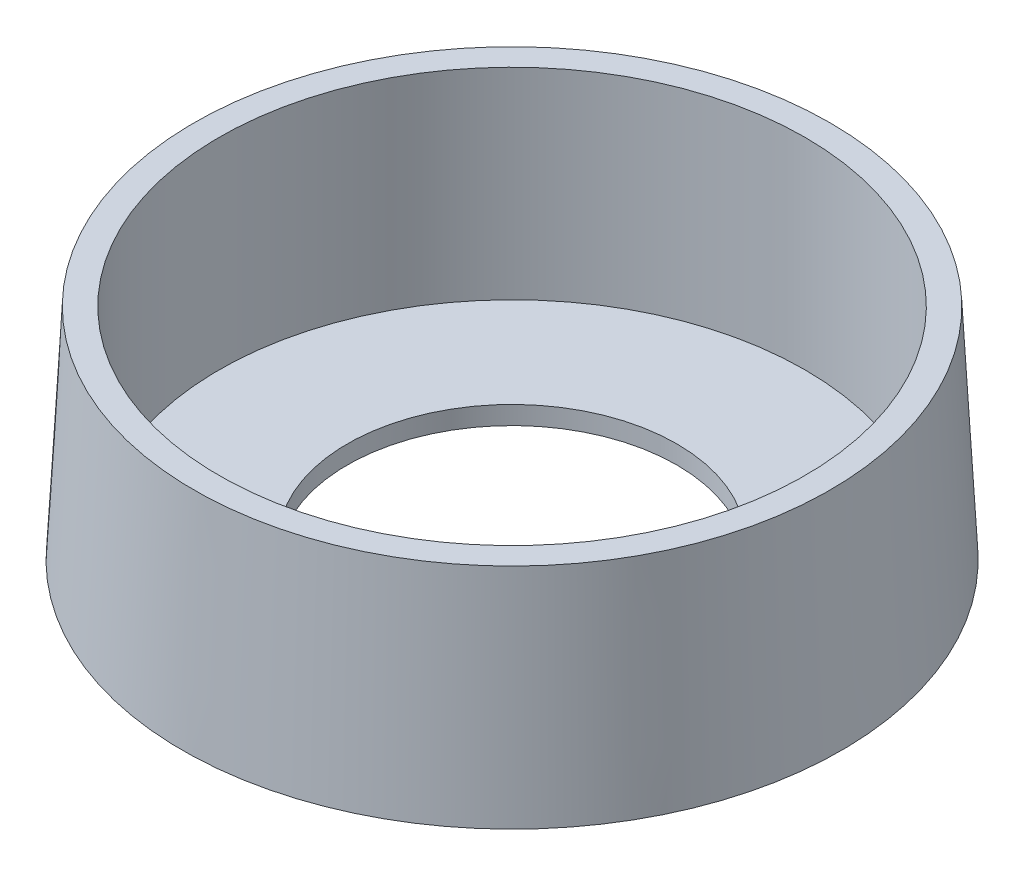
ISO-10303-21;
HEADER;
FILE_DESCRIPTION(('STEP AP214'),'2;1');
FILE_NAME('part.step','',(''),(''),'','','');
FILE_SCHEMA(('AUTOMOTIVE_DESIGN { 1 0 10303 214 1 1 1 1 }'));
ENDSEC;
DATA;
#1=APPLICATION_CONTEXT('core data for automotive mechanical design processes');
#2=APPLICATION_PROTOCOL_DEFINITION('international standard','automotive_design',2000,#1);
#3=PRODUCT_CONTEXT('',#1,'mechanical');
#4=PRODUCT('Part','Part','',(#3));
#5=PRODUCT_RELATED_PRODUCT_CATEGORY('part','',(#4));
#6=PRODUCT_DEFINITION_FORMATION('','',#4);
#7=PRODUCT_DEFINITION_CONTEXT('part definition',#1,'design');
#8=PRODUCT_DEFINITION('design','',#6,#7);
#9=PRODUCT_DEFINITION_SHAPE('','',#8);
#10=(LENGTH_UNIT() NAMED_UNIT(*) SI_UNIT(.MILLI.,.METRE.));
#11=(NAMED_UNIT(*) PLANE_ANGLE_UNIT() SI_UNIT($,.RADIAN.));
#12=(NAMED_UNIT(*) SI_UNIT($,.STERADIAN.) SOLID_ANGLE_UNIT());
#13=UNCERTAINTY_MEASURE_WITH_UNIT(LENGTH_MEASURE(1.E-05),#10,'distance_accuracy_value','');
#14=(GEOMETRIC_REPRESENTATION_CONTEXT(3) GLOBAL_UNCERTAINTY_ASSIGNED_CONTEXT((#13)) GLOBAL_UNIT_ASSIGNED_CONTEXT((#10,
#11,#12)) REPRESENTATION_CONTEXT('',''));
#15=CARTESIAN_POINT('',(0.,0.,0.));
#16=DIRECTION('',(0.,0.,1.));
#17=DIRECTION('',(1.,0.,0.));
#18=AXIS2_PLACEMENT_3D('',#15,#16,#17);
#19=CARTESIAN_POINT('',(0.,0.,0.));
#20=DIRECTION('',(0.,-1.,0.));
#21=DIRECTION('',(0.,0.,-1.));
#22=AXIS2_PLACEMENT_3D('',#19,#20,#21);
#23=CYLINDRICAL_SURFACE('',#22,4.5);
#24=CARTESIAN_POINT('',(0.,0.5,0.));
#25=DIRECTION('',(0.,-1.,0.));
#26=DIRECTION('',(0.,0.,-1.));
#27=AXIS2_PLACEMENT_3D('',#24,#25,#26);
#28=CIRCLE('',#27,4.5);
#29=CARTESIAN_POINT('',(0.,0.5,-4.5));
#30=VERTEX_POINT('',#29);
#31=EDGE_CURVE('E60',#30,#30,#28,.T.);
#32=ORIENTED_EDGE('',*,*,#31,.F.);
#33=EDGE_LOOP('',(#32));
#34=FACE_BOUND('',#33,.T.);
#35=CARTESIAN_POINT('',(0.,0.,0.));
#36=DIRECTION('',(0.,-1.,0.));
#37=DIRECTION('',(0.,0.,-1.));
#38=AXIS2_PLACEMENT_3D('',#35,#36,#37);
#39=CIRCLE('',#38,4.5);
#40=CARTESIAN_POINT('',(0.,0.,-4.5));
#41=VERTEX_POINT('',#40);
#42=EDGE_CURVE('E10',#41,#41,#39,.T.);
#43=ORIENTED_EDGE('',*,*,#42,.T.);
#44=EDGE_LOOP('',(#43));
#45=FACE_BOUND('',#44,.T.);
#46=ADVANCED_FACE('F40',(#34,#45),#23,.F.);
#47=CARTESIAN_POINT('',(0.,0.,4.5));
#48=DIRECTION('',(0.,1.,0.));
#49=DIRECTION('',(0.,0.,1.));
#50=AXIS2_PLACEMENT_3D('',#47,#48,#49);
#51=PLANE('',#50);
#52=ORIENTED_EDGE('',*,*,#42,.F.);
#53=EDGE_LOOP('',(#52));
#54=FACE_BOUND('',#53,.T.);
#55=CARTESIAN_POINT('',(0.,0.,0.));
#56=DIRECTION('',(0.,-1.,0.));
#57=DIRECTION('',(0.,0.,-1.));
#58=AXIS2_PLACEMENT_3D('',#55,#56,#57);
#59=CIRCLE('',#58,9.);
#60=CARTESIAN_POINT('',(0.,0.,-9.));
#61=VERTEX_POINT('',#60);
#62=EDGE_CURVE('E44',#61,#61,#59,.T.);
#63=ORIENTED_EDGE('',*,*,#62,.T.);
#64=EDGE_LOOP('',(#63));
#65=FACE_BOUND('',#64,.T.);
#66=ADVANCED_FACE('F63',(#54,#65),#51,.F.);
#67=CARTESIAN_POINT('',(0.,0.,0.));
#68=DIRECTION('',(0.,-1.,0.));
#69=DIRECTION('',(0.,0.,-1.));
#70=AXIS2_PLACEMENT_3D('',#67,#68,#69);
#71=CONICAL_SURFACE('',#70,9.,0.05235987755983);
#72=ORIENTED_EDGE('',*,*,#62,.F.);
#73=EDGE_LOOP('',(#72));
#74=FACE_BOUND('',#73,.T.);
#75=CARTESIAN_POINT('',(0.,6.,0.));
#76=DIRECTION('',(0.,-1.,0.));
#77=DIRECTION('',(0.,0.,-1.));
#78=AXIS2_PLACEMENT_3D('',#75,#76,#77);
#79=CIRCLE('',#78,8.68555332430175);
#80=CARTESIAN_POINT('',(0.,6.,-8.68555332430175));
#81=VERTEX_POINT('',#80);
#82=EDGE_CURVE('E41',#81,#81,#79,.T.);
#83=ORIENTED_EDGE('',*,*,#82,.T.);
#84=EDGE_LOOP('',(#83));
#85=FACE_BOUND('',#84,.T.);
#86=ADVANCED_FACE('F39',(#74,#85),#71,.T.);
#87=CARTESIAN_POINT('',(0.,6.,9.));
#88=DIRECTION('',(0.,-1.,0.));
#89=DIRECTION('',(0.,0.,-1.));
#90=AXIS2_PLACEMENT_3D('',#87,#88,#89);
#91=PLANE('',#90);
#92=ORIENTED_EDGE('',*,*,#82,.F.);
#93=EDGE_LOOP('',(#92));
#94=FACE_BOUND('',#93,.T.);
#95=CARTESIAN_POINT('',(0.,6.,0.));
#96=DIRECTION('',(0.,-1.,0.));
#97=DIRECTION('',(0.,0.,-1.));
#98=AXIS2_PLACEMENT_3D('',#95,#96,#97);
#99=CIRCLE('',#98,8.);
#100=CARTESIAN_POINT('',(0.,6.,-8.));
#101=VERTEX_POINT('',#100);
#102=EDGE_CURVE('E51',#101,#101,#99,.T.);
#103=ORIENTED_EDGE('',*,*,#102,.T.);
#104=EDGE_LOOP('',(#103));
#105=FACE_BOUND('',#104,.T.);
#106=ADVANCED_FACE('F72',(#94,#105),#91,.F.);
#107=CARTESIAN_POINT('',(0.,0.,0.));
#108=DIRECTION('',(0.,-1.,0.));
#109=DIRECTION('',(0.,0.,-1.));
#110=AXIS2_PLACEMENT_3D('',#107,#108,#109);
#111=CYLINDRICAL_SURFACE('',#110,8.);
#112=ORIENTED_EDGE('',*,*,#102,.F.);
#113=EDGE_LOOP('',(#112));
#114=FACE_BOUND('',#113,.T.);
#115=CARTESIAN_POINT('',(0.,0.5,0.));
#116=DIRECTION('',(0.,-1.,0.));
#117=DIRECTION('',(0.,0.,-1.));
#118=AXIS2_PLACEMENT_3D('',#115,#116,#117);
#119=CIRCLE('',#118,8.);
#120=CARTESIAN_POINT('',(0.,0.5,-8.));
#121=VERTEX_POINT('',#120);
#122=EDGE_CURVE('E53',#121,#121,#119,.T.);
#123=ORIENTED_EDGE('',*,*,#122,.T.);
#124=EDGE_LOOP('',(#123));
#125=FACE_BOUND('',#124,.T.);
#126=ADVANCED_FACE('F74',(#114,#125),#111,.F.);
#127=CARTESIAN_POINT('',(0.,0.5,8.));
#128=DIRECTION('',(0.,-1.,0.));
#129=DIRECTION('',(0.,0.,-1.));
#130=AXIS2_PLACEMENT_3D('',#127,#128,#129);
#131=PLANE('',#130);
#132=ORIENTED_EDGE('',*,*,#122,.F.);
#133=EDGE_LOOP('',(#132));
#134=FACE_BOUND('',#133,.T.);
#135=ORIENTED_EDGE('',*,*,#31,.T.);
#136=EDGE_LOOP('',(#135));
#137=FACE_BOUND('',#136,.T.);
#138=ADVANCED_FACE('F61',(#134,#137),#131,.F.);
#139=CLOSED_SHELL('',(#46,#66,#86,#106,#126,#138));
#140=MANIFOLD_SOLID_BREP('B2',#139);
#141=ADVANCED_BREP_SHAPE_REPRESENTATION('',(#18,#140),#14);
#142=SHAPE_DEFINITION_REPRESENTATION(#9,#141);
ENDSEC;
END-ISO-10303-21;
